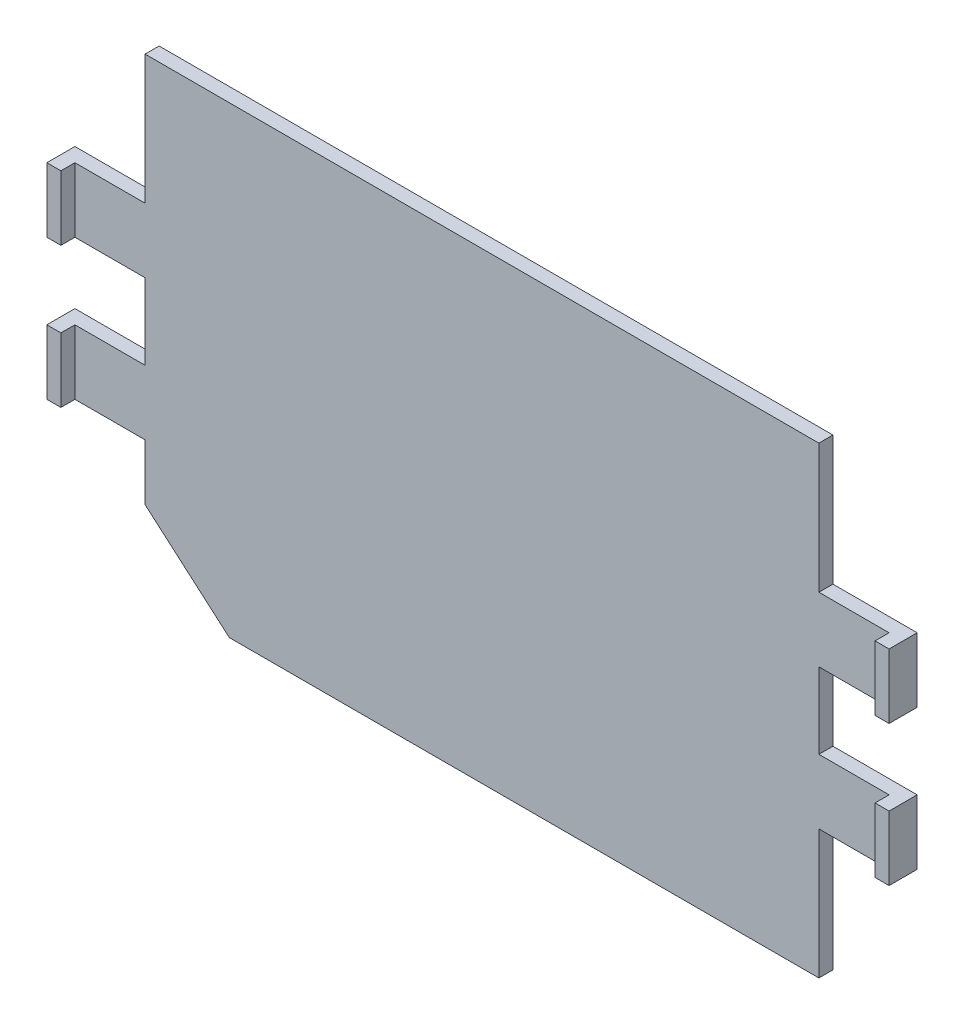
ISO-10303-21;
HEADER;
FILE_DESCRIPTION(('STEP AP214'),'2;1');
FILE_NAME('part.step','',(''),(''),'','','');
FILE_SCHEMA(('AUTOMOTIVE_DESIGN { 1 0 10303 214 1 1 1 1 }'));
ENDSEC;
DATA;
#1=APPLICATION_CONTEXT('core data for automotive mechanical design processes');
#2=APPLICATION_PROTOCOL_DEFINITION('international standard','automotive_design',2000,#1);
#3=PRODUCT_CONTEXT('',#1,'mechanical');
#4=PRODUCT('Part','Part','',(#3));
#5=PRODUCT_RELATED_PRODUCT_CATEGORY('part','',(#4));
#6=PRODUCT_DEFINITION_FORMATION('','',#4);
#7=PRODUCT_DEFINITION_CONTEXT('part definition',#1,'design');
#8=PRODUCT_DEFINITION('design','',#6,#7);
#9=PRODUCT_DEFINITION_SHAPE('','',#8);
#10=(LENGTH_UNIT() NAMED_UNIT(*) SI_UNIT(.MILLI.,.METRE.));
#11=(NAMED_UNIT(*) PLANE_ANGLE_UNIT() SI_UNIT($,.RADIAN.));
#12=(NAMED_UNIT(*) SI_UNIT($,.STERADIAN.) SOLID_ANGLE_UNIT());
#13=UNCERTAINTY_MEASURE_WITH_UNIT(LENGTH_MEASURE(1.E-05),#10,'distance_accuracy_value','');
#14=(GEOMETRIC_REPRESENTATION_CONTEXT(3) GLOBAL_UNCERTAINTY_ASSIGNED_CONTEXT((#13)) GLOBAL_UNIT_ASSIGNED_CONTEXT((#10,
#11,#12)) REPRESENTATION_CONTEXT('',''));
#15=CARTESIAN_POINT('',(0.,0.,0.));
#16=DIRECTION('',(0.,0.,1.));
#17=DIRECTION('',(1.,0.,0.));
#18=AXIS2_PLACEMENT_3D('',#15,#16,#17);
#19=CARTESIAN_POINT('',(-1.45,0.365,0.05));
#20=DIRECTION('',(-1.,0.,0.));
#21=DIRECTION('',(0.,-1.,0.));
#22=AXIS2_PLACEMENT_3D('',#19,#20,#21);
#23=PLANE('',#22);
#24=DIRECTION('',(0.,0.,1.));
#25=VECTOR('',#24,1.);
#26=CARTESIAN_POINT('',(-1.45,0.365,-0.05));
#27=LINE('',#26,#25);
#28=CARTESIAN_POINT('',(-1.45,0.365,0.));
#29=VERTEX_POINT('',#28);
#30=CARTESIAN_POINT('',(-1.45,0.365,0.05));
#31=VERTEX_POINT('',#30);
#32=EDGE_CURVE('E249',#29,#31,#27,.T.);
#33=ORIENTED_EDGE('',*,*,#32,.T.);
#34=DIRECTION('',(0.,1.,0.));
#35=VECTOR('',#34,1.);
#36=CARTESIAN_POINT('',(-1.45,0.,0.05));
#37=LINE('',#36,#35);
#38=CARTESIAN_POINT('',(-1.45,0.135,0.05));
#39=VERTEX_POINT('',#38);
#40=EDGE_CURVE('E20',#31,#39,#37,.F.);
#41=ORIENTED_EDGE('',*,*,#40,.T.);
#42=DIRECTION('',(0.,0.,1.));
#43=VECTOR('',#42,1.);
#44=CARTESIAN_POINT('',(-1.45,0.135,-0.05));
#45=LINE('',#44,#43);
#46=CARTESIAN_POINT('',(-1.45,0.135,0.));
#47=VERTEX_POINT('',#46);
#48=EDGE_CURVE('E246',#39,#47,#45,.F.);
#49=ORIENTED_EDGE('',*,*,#48,.T.);
#50=DIRECTION('',(0.,1.,0.));
#51=VECTOR('',#50,1.);
#52=CARTESIAN_POINT('',(-1.45,0.,0.));
#53=LINE('',#52,#51);
#54=EDGE_CURVE('E282',#47,#29,#53,.T.);
#55=ORIENTED_EDGE('',*,*,#54,.T.);
#56=EDGE_LOOP('',(#33,#41,#49,#55));
#57=FACE_BOUND('',#56,.T.);
#58=ADVANCED_FACE('F17',(#57),#23,.F.);
#59=CARTESIAN_POINT('',(0.,0.,0.05));
#60=DIRECTION('',(0.,0.,-1.));
#61=DIRECTION('',(-1.,0.,0.));
#62=AXIS2_PLACEMENT_3D('',#59,#60,#61);
#63=PLANE('',#62);
#64=DIRECTION('',(1.,0.,0.));
#65=VECTOR('',#64,1.);
#66=CARTESIAN_POINT('',(-1.5,0.135,0.05));
#67=LINE('',#66,#65);
#68=CARTESIAN_POINT('',(-1.5,0.135,0.05));
#69=VERTEX_POINT('',#68);
#70=EDGE_CURVE('E253',#69,#39,#67,.T.);
#71=ORIENTED_EDGE('',*,*,#70,.T.);
#72=ORIENTED_EDGE('',*,*,#40,.F.);
#73=DIRECTION('',(1.,0.,0.));
#74=VECTOR('',#73,1.);
#75=CARTESIAN_POINT('',(-1.2,0.365,0.05));
#76=LINE('',#75,#74);
#77=CARTESIAN_POINT('',(-1.5,0.365,0.05));
#78=VERTEX_POINT('',#77);
#79=EDGE_CURVE('E388',#31,#78,#76,.F.);
#80=ORIENTED_EDGE('',*,*,#79,.T.);
#81=DIRECTION('',(0.,1.,0.));
#82=VECTOR('',#81,1.);
#83=CARTESIAN_POINT('',(-1.5,0.365,0.05));
#84=LINE('',#83,#82);
#85=EDGE_CURVE('E256',#78,#69,#84,.F.);
#86=ORIENTED_EDGE('',*,*,#85,.T.);
#87=EDGE_LOOP('',(#71,#72,#80,#86));
#88=FACE_BOUND('',#87,.T.);
#89=ADVANCED_FACE('F254',(#88),#63,.F.);
#90=CARTESIAN_POINT('',(1.45,0.365,0.05));
#91=DIRECTION('',(1.,0.,0.));
#92=DIRECTION('',(0.,1.,0.));
#93=AXIS2_PLACEMENT_3D('',#90,#91,#92);
#94=PLANE('',#93);
#95=DIRECTION('',(0.,0.,1.));
#96=VECTOR('',#95,1.);
#97=CARTESIAN_POINT('',(1.45,0.135,-0.05));
#98=LINE('',#97,#96);
#99=CARTESIAN_POINT('',(1.45,0.135,0.));
#100=VERTEX_POINT('',#99);
#101=CARTESIAN_POINT('',(1.45,0.135,0.05));
#102=VERTEX_POINT('',#101);
#103=EDGE_CURVE('E353',#100,#102,#98,.T.);
#104=ORIENTED_EDGE('',*,*,#103,.T.);
#105=DIRECTION('',(0.,1.,0.));
#106=VECTOR('',#105,1.);
#107=CARTESIAN_POINT('',(1.45,0.,0.05));
#108=LINE('',#107,#106);
#109=CARTESIAN_POINT('',(1.45,0.365,0.05));
#110=VERTEX_POINT('',#109);
#111=EDGE_CURVE('E238',#102,#110,#108,.T.);
#112=ORIENTED_EDGE('',*,*,#111,.T.);
#113=DIRECTION('',(0.,0.,1.));
#114=VECTOR('',#113,1.);
#115=CARTESIAN_POINT('',(1.45,0.365,-0.05));
#116=LINE('',#115,#114);
#117=CARTESIAN_POINT('',(1.45,0.365,0.));
#118=VERTEX_POINT('',#117);
#119=EDGE_CURVE('E365',#110,#118,#116,.F.);
#120=ORIENTED_EDGE('',*,*,#119,.T.);
#121=DIRECTION('',(0.,1.,0.));
#122=VECTOR('',#121,1.);
#123=CARTESIAN_POINT('',(1.45,0.,0.));
#124=LINE('',#123,#122);
#125=EDGE_CURVE('E280',#118,#100,#124,.F.);
#126=ORIENTED_EDGE('',*,*,#125,.T.);
#127=EDGE_LOOP('',(#104,#112,#120,#126));
#128=FACE_BOUND('',#127,.T.);
#129=ADVANCED_FACE('F534',(#128),#94,.F.);
#130=CARTESIAN_POINT('',(0.,0.,0.05));
#131=DIRECTION('',(0.,0.,-1.));
#132=DIRECTION('',(-1.,0.,0.));
#133=AXIS2_PLACEMENT_3D('',#130,#131,#132);
#134=PLANE('',#133);
#135=DIRECTION('',(1.,0.,0.));
#136=VECTOR('',#135,1.);
#137=CARTESIAN_POINT('',(1.5,0.365,0.05));
#138=LINE('',#137,#136);
#139=CARTESIAN_POINT('',(1.5,0.365,0.05));
#140=VERTEX_POINT('',#139);
#141=EDGE_CURVE('E367',#140,#110,#138,.F.);
#142=ORIENTED_EDGE('',*,*,#141,.T.);
#143=ORIENTED_EDGE('',*,*,#111,.F.);
#144=DIRECTION('',(1.,0.,0.));
#145=VECTOR('',#144,1.);
#146=CARTESIAN_POINT('',(1.2,0.135,0.05));
#147=LINE('',#146,#145);
#148=CARTESIAN_POINT('',(1.5,0.135,0.05));
#149=VERTEX_POINT('',#148);
#150=EDGE_CURVE('E351',#102,#149,#147,.T.);
#151=ORIENTED_EDGE('',*,*,#150,.T.);
#152=DIRECTION('',(0.,-1.,0.));
#153=VECTOR('',#152,1.);
#154=CARTESIAN_POINT('',(1.5,0.135,0.05));
#155=LINE('',#154,#153);
#156=EDGE_CURVE('E360',#149,#140,#155,.F.);
#157=ORIENTED_EDGE('',*,*,#156,.T.);
#158=EDGE_LOOP('',(#142,#143,#151,#157));
#159=FACE_BOUND('',#158,.T.);
#160=ADVANCED_FACE('F536',(#159),#134,.F.);
#161=CARTESIAN_POINT('',(1.45,-0.135,0.05));
#162=DIRECTION('',(1.,0.,0.));
#163=DIRECTION('',(0.,1.,0.));
#164=AXIS2_PLACEMENT_3D('',#161,#162,#163);
#165=PLANE('',#164);
#166=DIRECTION('',(0.,0.,1.));
#167=VECTOR('',#166,1.);
#168=CARTESIAN_POINT('',(1.45,-0.365,-0.05));
#169=LINE('',#168,#167);
#170=CARTESIAN_POINT('',(1.45,-0.365,0.));
#171=VERTEX_POINT('',#170);
#172=CARTESIAN_POINT('',(1.45,-0.365,0.05));
#173=VERTEX_POINT('',#172);
#174=EDGE_CURVE('E326',#171,#173,#169,.T.);
#175=ORIENTED_EDGE('',*,*,#174,.T.);
#176=DIRECTION('',(0.,1.,0.));
#177=VECTOR('',#176,1.);
#178=CARTESIAN_POINT('',(1.45,0.,0.05));
#179=LINE('',#178,#177);
#180=CARTESIAN_POINT('',(1.45,-0.135,0.05));
#181=VERTEX_POINT('',#180);
#182=EDGE_CURVE('E220',#173,#181,#179,.T.);
#183=ORIENTED_EDGE('',*,*,#182,.T.);
#184=DIRECTION('',(0.,0.,1.));
#185=VECTOR('',#184,1.);
#186=CARTESIAN_POINT('',(1.45,-0.135,-0.05));
#187=LINE('',#186,#185);
#188=CARTESIAN_POINT('',(1.45,-0.135,0.));
#189=VERTEX_POINT('',#188);
#190=EDGE_CURVE('E337',#181,#189,#187,.F.);
#191=ORIENTED_EDGE('',*,*,#190,.T.);
#192=DIRECTION('',(0.,1.,0.));
#193=VECTOR('',#192,1.);
#194=CARTESIAN_POINT('',(1.45,0.,0.));
#195=LINE('',#194,#193);
#196=EDGE_CURVE('E278',#189,#171,#195,.F.);
#197=ORIENTED_EDGE('',*,*,#196,.T.);
#198=EDGE_LOOP('',(#175,#183,#191,#197));
#199=FACE_BOUND('',#198,.T.);
#200=ADVANCED_FACE('F530',(#199),#165,.F.);
#201=CARTESIAN_POINT('',(0.,0.,0.05));
#202=DIRECTION('',(0.,0.,-1.));
#203=DIRECTION('',(-1.,0.,0.));
#204=AXIS2_PLACEMENT_3D('',#201,#202,#203);
#205=PLANE('',#204);
#206=DIRECTION('',(1.,0.,0.));
#207=VECTOR('',#206,1.);
#208=CARTESIAN_POINT('',(1.5,-0.135,0.05));
#209=LINE('',#208,#207);
#210=CARTESIAN_POINT('',(1.5,-0.135,0.05));
#211=VERTEX_POINT('',#210);
#212=EDGE_CURVE('E339',#211,#181,#209,.F.);
#213=ORIENTED_EDGE('',*,*,#212,.T.);
#214=ORIENTED_EDGE('',*,*,#182,.F.);
#215=DIRECTION('',(1.,0.,0.));
#216=VECTOR('',#215,1.);
#217=CARTESIAN_POINT('',(1.2,-0.365,0.05));
#218=LINE('',#217,#216);
#219=CARTESIAN_POINT('',(1.5,-0.365,0.05));
#220=VERTEX_POINT('',#219);
#221=EDGE_CURVE('E324',#173,#220,#218,.T.);
#222=ORIENTED_EDGE('',*,*,#221,.T.);
#223=DIRECTION('',(0.,-1.,0.));
#224=VECTOR('',#223,1.);
#225=CARTESIAN_POINT('',(1.5,-0.365,0.05));
#226=LINE('',#225,#224);
#227=EDGE_CURVE('E333',#220,#211,#226,.F.);
#228=ORIENTED_EDGE('',*,*,#227,.T.);
#229=EDGE_LOOP('',(#213,#214,#222,#228));
#230=FACE_BOUND('',#229,.T.);
#231=ADVANCED_FACE('F532',(#230),#205,.F.);
#232=CARTESIAN_POINT('',(0.,0.,0.));
#233=DIRECTION('',(0.,0.,-1.));
#234=DIRECTION('',(-1.,0.,0.));
#235=AXIS2_PLACEMENT_3D('',#232,#233,#234);
#236=PLANE('',#235);
#237=DIRECTION('',(1.,0.,0.));
#238=VECTOR('',#237,1.);
#239=CARTESIAN_POINT('',(1.5,-0.135,0.));
#240=LINE('',#239,#238);
#241=CARTESIAN_POINT('',(1.2,-0.135,0.));
#242=VERTEX_POINT('',#241);
#243=EDGE_CURVE('E335',#189,#242,#240,.F.);
#244=ORIENTED_EDGE('',*,*,#243,.T.);
#245=DIRECTION('',(0.,-1.,0.));
#246=VECTOR('',#245,1.);
#247=CARTESIAN_POINT('',(1.2,-0.135,0.));
#248=LINE('',#247,#246);
#249=CARTESIAN_POINT('',(1.2,0.135,0.));
#250=VERTEX_POINT('',#249);
#251=EDGE_CURVE('E344',#242,#250,#248,.F.);
#252=ORIENTED_EDGE('',*,*,#251,.T.);
#253=DIRECTION('',(1.,0.,0.));
#254=VECTOR('',#253,1.);
#255=CARTESIAN_POINT('',(1.2,0.135,0.));
#256=LINE('',#255,#254);
#257=EDGE_CURVE('E355',#250,#100,#256,.T.);
#258=ORIENTED_EDGE('',*,*,#257,.T.);
#259=ORIENTED_EDGE('',*,*,#125,.F.);
#260=DIRECTION('',(1.,0.,0.));
#261=VECTOR('',#260,1.);
#262=CARTESIAN_POINT('',(1.5,0.365,0.));
#263=LINE('',#262,#261);
#264=CARTESIAN_POINT('',(1.2,0.365,0.));
#265=VERTEX_POINT('',#264);
#266=EDGE_CURVE('E362',#118,#265,#263,.F.);
#267=ORIENTED_EDGE('',*,*,#266,.T.);
#268=DIRECTION('',(0.,-1.,0.));
#269=VECTOR('',#268,1.);
#270=CARTESIAN_POINT('',(1.2,0.365,0.));
#271=LINE('',#270,#269);
#272=CARTESIAN_POINT('',(1.2,0.825,0.));
#273=VERTEX_POINT('',#272);
#274=EDGE_CURVE('E371',#265,#273,#271,.F.);
#275=ORIENTED_EDGE('',*,*,#274,.T.);
#276=DIRECTION('',(1.,0.,0.));
#277=VECTOR('',#276,1.);
#278=CARTESIAN_POINT('',(1.2,0.825,0.));
#279=LINE('',#278,#277);
#280=CARTESIAN_POINT('',(-1.2,0.825,0.));
#281=VERTEX_POINT('',#280);
#282=EDGE_CURVE('E376',#273,#281,#279,.F.);
#283=ORIENTED_EDGE('',*,*,#282,.T.);
#284=DIRECTION('',(0.,1.,0.));
#285=VECTOR('',#284,1.);
#286=CARTESIAN_POINT('',(-1.2,0.825,0.));
#287=LINE('',#286,#285);
#288=CARTESIAN_POINT('',(-1.2,0.365,0.));
#289=VERTEX_POINT('',#288);
#290=EDGE_CURVE('E381',#281,#289,#287,.F.);
#291=ORIENTED_EDGE('',*,*,#290,.T.);
#292=DIRECTION('',(1.,0.,0.));
#293=VECTOR('',#292,1.);
#294=CARTESIAN_POINT('',(-1.2,0.365,0.));
#295=LINE('',#294,#293);
#296=EDGE_CURVE('E391',#289,#29,#295,.F.);
#297=ORIENTED_EDGE('',*,*,#296,.T.);
#298=ORIENTED_EDGE('',*,*,#54,.F.);
#299=DIRECTION('',(1.,0.,0.));
#300=VECTOR('',#299,1.);
#301=CARTESIAN_POINT('',(-1.5,0.135,0.));
#302=LINE('',#301,#300);
#303=CARTESIAN_POINT('',(-1.2,0.135,0.));
#304=VERTEX_POINT('',#303);
#305=EDGE_CURVE('E265',#47,#304,#302,.T.);
#306=ORIENTED_EDGE('',*,*,#305,.T.);
#307=DIRECTION('',(0.,1.,0.));
#308=VECTOR('',#307,1.);
#309=CARTESIAN_POINT('',(-1.2,0.135,0.));
#310=LINE('',#309,#308);
#311=CARTESIAN_POINT('',(-1.2,-0.135,0.));
#312=VERTEX_POINT('',#311);
#313=EDGE_CURVE('E271',#304,#312,#310,.F.);
#314=ORIENTED_EDGE('',*,*,#313,.T.);
#315=DIRECTION('',(-1.,0.,0.));
#316=VECTOR('',#315,1.);
#317=CARTESIAN_POINT('',(0.,-0.135,0.));
#318=LINE('',#317,#316);
#319=CARTESIAN_POINT('',(-1.45,-0.135,0.));
#320=VERTEX_POINT('',#319);
#321=EDGE_CURVE('E234',#320,#312,#318,.F.);
#322=ORIENTED_EDGE('',*,*,#321,.F.);
#323=DIRECTION('',(0.,-1.,0.));
#324=VECTOR('',#323,1.);
#325=CARTESIAN_POINT('',(-1.45,-0.135,0.));
#326=LINE('',#325,#324);
#327=CARTESIAN_POINT('',(-1.45,-0.365,0.));
#328=VERTEX_POINT('',#327);
#329=EDGE_CURVE('E276',#320,#328,#326,.T.);
#330=ORIENTED_EDGE('',*,*,#329,.T.);
#331=DIRECTION('',(-1.,0.,0.));
#332=VECTOR('',#331,1.);
#333=CARTESIAN_POINT('',(0.,-0.365,0.));
#334=LINE('',#333,#332);
#335=CARTESIAN_POINT('',(-1.2,-0.365,0.));
#336=VERTEX_POINT('',#335);
#337=EDGE_CURVE('E232',#336,#328,#334,.T.);
#338=ORIENTED_EDGE('',*,*,#337,.F.);
#339=DIRECTION('',(0.,1.,0.));
#340=VECTOR('',#339,1.);
#341=CARTESIAN_POINT('',(-1.2,0.,0.));
#342=LINE('',#341,#340);
#343=CARTESIAN_POINT('',(-1.2,-0.565,0.));
#344=VERTEX_POINT('',#343);
#345=EDGE_CURVE('E206',#344,#336,#342,.T.);
#346=ORIENTED_EDGE('',*,*,#345,.F.);
#347=DIRECTION('',(-0.755689082789817,0.654930538417842,0.));
#348=VECTOR('',#347,1.);
#349=CARTESIAN_POINT('',(-0.9,-0.825,0.));
#350=LINE('',#349,#348);
#351=CARTESIAN_POINT('',(-0.9,-0.825,0.));
#352=VERTEX_POINT('',#351);
#353=EDGE_CURVE('E211',#352,#344,#350,.T.);
#354=ORIENTED_EDGE('',*,*,#353,.F.);
#355=DIRECTION('',(1.,0.,0.));
#356=VECTOR('',#355,1.);
#357=CARTESIAN_POINT('',(-0.9,-0.825,0.));
#358=LINE('',#357,#356);
#359=CARTESIAN_POINT('',(1.2,-0.825,0.));
#360=VERTEX_POINT('',#359);
#361=EDGE_CURVE('E313',#352,#360,#358,.T.);
#362=ORIENTED_EDGE('',*,*,#361,.T.);
#363=DIRECTION('',(0.,-1.,0.));
#364=VECTOR('',#363,1.);
#365=CARTESIAN_POINT('',(1.2,-0.825,0.));
#366=LINE('',#365,#364);
#367=CARTESIAN_POINT('',(1.2,-0.365,0.));
#368=VERTEX_POINT('',#367);
#369=EDGE_CURVE('E317',#360,#368,#366,.F.);
#370=ORIENTED_EDGE('',*,*,#369,.T.);
#371=DIRECTION('',(1.,0.,0.));
#372=VECTOR('',#371,1.);
#373=CARTESIAN_POINT('',(1.2,-0.365,0.));
#374=LINE('',#373,#372);
#375=EDGE_CURVE('E328',#368,#171,#374,.T.);
#376=ORIENTED_EDGE('',*,*,#375,.T.);
#377=ORIENTED_EDGE('',*,*,#196,.F.);
#378=EDGE_LOOP('',(#244,#252,#258,#259,#267,#275,#283,#291,#297,#298,#306,#314,#322,#330,#338,
#346,#354,#362,#370,#376,#377));
#379=FACE_BOUND('',#378,.T.);
#380=ADVANCED_FACE('F230',(#379),#236,.F.);
#381=CARTESIAN_POINT('',(-1.45,-0.135,0.05));
#382=DIRECTION('',(-1.,0.,0.));
#383=DIRECTION('',(0.,-1.,0.));
#384=AXIS2_PLACEMENT_3D('',#381,#382,#383);
#385=PLANE('',#384);
#386=DIRECTION('',(0.,0.,1.));
#387=VECTOR('',#386,1.);
#388=CARTESIAN_POINT('',(-1.45,-0.135,-0.05));
#389=LINE('',#388,#387);
#390=CARTESIAN_POINT('',(-1.45,-0.135,0.05));
#391=VERTEX_POINT('',#390);
#392=EDGE_CURVE('E290',#320,#391,#389,.T.);
#393=ORIENTED_EDGE('',*,*,#392,.T.);
#394=DIRECTION('',(0.,1.,0.));
#395=VECTOR('',#394,1.);
#396=CARTESIAN_POINT('',(-1.45,0.,0.05));
#397=LINE('',#396,#395);
#398=CARTESIAN_POINT('',(-1.45,-0.365,0.05));
#399=VERTEX_POINT('',#398);
#400=EDGE_CURVE('E274',#391,#399,#397,.F.);
#401=ORIENTED_EDGE('',*,*,#400,.T.);
#402=DIRECTION('',(0.,0.,1.));
#403=VECTOR('',#402,1.);
#404=CARTESIAN_POINT('',(-1.45,-0.365,-0.05));
#405=LINE('',#404,#403);
#406=EDGE_CURVE('E305',#399,#328,#405,.F.);
#407=ORIENTED_EDGE('',*,*,#406,.T.);
#408=ORIENTED_EDGE('',*,*,#329,.F.);
#409=EDGE_LOOP('',(#393,#401,#407,#408));
#410=FACE_BOUND('',#409,.T.);
#411=ADVANCED_FACE('F597',(#410),#385,.F.);
#412=CARTESIAN_POINT('',(0.,0.,0.05));
#413=DIRECTION('',(0.,0.,-1.));
#414=DIRECTION('',(-1.,0.,0.));
#415=AXIS2_PLACEMENT_3D('',#412,#413,#414);
#416=PLANE('',#415);
#417=DIRECTION('',(1.,0.,0.));
#418=VECTOR('',#417,1.);
#419=CARTESIAN_POINT('',(-1.5,-0.365,0.05));
#420=LINE('',#419,#418);
#421=CARTESIAN_POINT('',(-1.5,-0.365,0.05));
#422=VERTEX_POINT('',#421);
#423=EDGE_CURVE('E308',#422,#399,#420,.T.);
#424=ORIENTED_EDGE('',*,*,#423,.T.);
#425=ORIENTED_EDGE('',*,*,#400,.F.);
#426=DIRECTION('',(1.,0.,0.));
#427=VECTOR('',#426,1.);
#428=CARTESIAN_POINT('',(-1.2,-0.135,0.05));
#429=LINE('',#428,#427);
#430=CARTESIAN_POINT('',(-1.5,-0.135,0.05));
#431=VERTEX_POINT('',#430);
#432=EDGE_CURVE('E298',#391,#431,#429,.F.);
#433=ORIENTED_EDGE('',*,*,#432,.T.);
#434=DIRECTION('',(0.,1.,0.));
#435=VECTOR('',#434,1.);
#436=CARTESIAN_POINT('',(-1.5,-0.135,0.05));
#437=LINE('',#436,#435);
#438=EDGE_CURVE('E300',#431,#422,#437,.F.);
#439=ORIENTED_EDGE('',*,*,#438,.T.);
#440=EDGE_LOOP('',(#424,#425,#433,#439));
#441=FACE_BOUND('',#440,.T.);
#442=ADVANCED_FACE('F417',(#441),#416,.F.);
#443=CARTESIAN_POINT('',(-1.2,0.135,-0.05));
#444=DIRECTION('',(1.,0.,0.));
#445=DIRECTION('',(0.,1.,0.));
#446=AXIS2_PLACEMENT_3D('',#443,#444,#445);
#447=PLANE('',#446);
#448=DIRECTION('',(0.,0.,1.));
#449=VECTOR('',#448,1.);
#450=CARTESIAN_POINT('',(-1.2,0.135,-0.05));
#451=LINE('',#450,#449);
#452=CARTESIAN_POINT('',(-1.2,0.135,-0.05));
#453=VERTEX_POINT('',#452);
#454=EDGE_CURVE('E259',#304,#453,#451,.F.);
#455=ORIENTED_EDGE('',*,*,#454,.T.);
#456=DIRECTION('',(0.,1.,0.));
#457=VECTOR('',#456,1.);
#458=CARTESIAN_POINT('',(-1.2,0.,-0.05));
#459=LINE('',#458,#457);
#460=CARTESIAN_POINT('',(-1.2,-0.135,-0.05));
#461=VERTEX_POINT('',#460);
#462=EDGE_CURVE('E295',#461,#453,#459,.T.);
#463=ORIENTED_EDGE('',*,*,#462,.F.);
#464=DIRECTION('',(0.,0.,1.));
#465=VECTOR('',#464,1.);
#466=CARTESIAN_POINT('',(-1.2,-0.135,-0.05));
#467=LINE('',#466,#465);
#468=EDGE_CURVE('E289',#461,#312,#467,.T.);
#469=ORIENTED_EDGE('',*,*,#468,.T.);
#470=ORIENTED_EDGE('',*,*,#313,.F.);
#471=EDGE_LOOP('',(#455,#463,#469,#470));
#472=FACE_BOUND('',#471,.T.);
#473=ADVANCED_FACE('F293',(#472),#447,.F.);
#474=CARTESIAN_POINT('',(-1.5,0.135,-0.05));
#475=DIRECTION('',(0.,1.,0.));
#476=DIRECTION('',(0.,0.,1.));
#477=AXIS2_PLACEMENT_3D('',#474,#475,#476);
#478=PLANE('',#477);
#479=ORIENTED_EDGE('',*,*,#48,.F.);
#480=ORIENTED_EDGE('',*,*,#70,.F.);
#481=DIRECTION('',(0.,0.,1.));
#482=VECTOR('',#481,1.);
#483=CARTESIAN_POINT('',(-1.5,0.135,-0.05));
#484=LINE('',#483,#482);
#485=CARTESIAN_POINT('',(-1.5,0.135,-0.05));
#486=VERTEX_POINT('',#485);
#487=EDGE_CURVE('E394',#69,#486,#484,.F.);
#488=ORIENTED_EDGE('',*,*,#487,.T.);
#489=DIRECTION('',(-1.,0.,0.));
#490=VECTOR('',#489,1.);
#491=CARTESIAN_POINT('',(0.,0.135,-0.05));
#492=LINE('',#491,#490);
#493=EDGE_CURVE('E398',#453,#486,#492,.T.);
#494=ORIENTED_EDGE('',*,*,#493,.F.);
#495=ORIENTED_EDGE('',*,*,#454,.F.);
#496=ORIENTED_EDGE('',*,*,#305,.F.);
#497=EDGE_LOOP('',(#479,#480,#488,#494,#495,#496));
#498=FACE_BOUND('',#497,.T.);
#499=ADVANCED_FACE('F262',(#498),#478,.F.);
#500=CARTESIAN_POINT('',(-1.5,0.365,-0.05));
#501=DIRECTION('',(1.,0.,0.));
#502=DIRECTION('',(0.,1.,0.));
#503=AXIS2_PLACEMENT_3D('',#500,#501,#502);
#504=PLANE('',#503);
#505=ORIENTED_EDGE('',*,*,#85,.F.);
#506=DIRECTION('',(0.,0.,1.));
#507=VECTOR('',#506,1.);
#508=CARTESIAN_POINT('',(-1.5,0.365,-0.05));
#509=LINE('',#508,#507);
#510=CARTESIAN_POINT('',(-1.5,0.365,-0.05));
#511=VERTEX_POINT('',#510);
#512=EDGE_CURVE('E386',#78,#511,#509,.F.);
#513=ORIENTED_EDGE('',*,*,#512,.T.);
#514=DIRECTION('',(0.,1.,0.));
#515=VECTOR('',#514,1.);
#516=CARTESIAN_POINT('',(-1.5,0.,-0.05));
#517=LINE('',#516,#515);
#518=EDGE_CURVE('E401',#486,#511,#517,.T.);
#519=ORIENTED_EDGE('',*,*,#518,.F.);
#520=ORIENTED_EDGE('',*,*,#487,.F.);
#521=EDGE_LOOP('',(#505,#513,#519,#520));
#522=FACE_BOUND('',#521,.T.);
#523=ADVANCED_FACE('F402',(#522),#504,.F.);
#524=CARTESIAN_POINT('',(-1.2,0.365,-0.05));
#525=DIRECTION('',(0.,-1.,0.));
#526=DIRECTION('',(1.,0.,0.));
#527=AXIS2_PLACEMENT_3D('',#524,#525,#526);
#528=PLANE('',#527);
#529=ORIENTED_EDGE('',*,*,#79,.F.);
#530=ORIENTED_EDGE('',*,*,#32,.F.);
#531=ORIENTED_EDGE('',*,*,#296,.F.);
#532=DIRECTION('',(0.,0.,1.));
#533=VECTOR('',#532,1.);
#534=CARTESIAN_POINT('',(-1.2,0.365,-0.05));
#535=LINE('',#534,#533);
#536=CARTESIAN_POINT('',(-1.2,0.365,-0.05));
#537=VERTEX_POINT('',#536);
#538=EDGE_CURVE('E384',#289,#537,#535,.F.);
#539=ORIENTED_EDGE('',*,*,#538,.T.);
#540=DIRECTION('',(-1.,0.,0.));
#541=VECTOR('',#540,1.);
#542=CARTESIAN_POINT('',(0.,0.365,-0.05));
#543=LINE('',#542,#541);
#544=EDGE_CURVE('E407',#511,#537,#543,.F.);
#545=ORIENTED_EDGE('',*,*,#544,.F.);
#546=ORIENTED_EDGE('',*,*,#512,.F.);
#547=EDGE_LOOP('',(#529,#530,#531,#539,#545,#546));
#548=FACE_BOUND('',#547,.T.);
#549=ADVANCED_FACE('F467',(#548),#528,.F.);
#550=CARTESIAN_POINT('',(-1.2,0.825,-0.05));
#551=DIRECTION('',(1.,0.,0.));
#552=DIRECTION('',(0.,1.,0.));
#553=AXIS2_PLACEMENT_3D('',#550,#551,#552);
#554=PLANE('',#553);
#555=DIRECTION('',(0.,0.,-1.));
#556=VECTOR('',#555,1.);
#557=CARTESIAN_POINT('',(-1.2,0.825,-0.05));
#558=LINE('',#557,#556);
#559=CARTESIAN_POINT('',(-1.2,0.825,-0.05));
#560=VERTEX_POINT('',#559);
#561=EDGE_CURVE('E379',#281,#560,#558,.T.);
#562=ORIENTED_EDGE('',*,*,#561,.T.);
#563=DIRECTION('',(0.,1.,0.));
#564=VECTOR('',#563,1.);
#565=CARTESIAN_POINT('',(-1.2,0.,-0.05));
#566=LINE('',#565,#564);
#567=EDGE_CURVE('E463',#537,#560,#566,.T.);
#568=ORIENTED_EDGE('',*,*,#567,.F.);
#569=ORIENTED_EDGE('',*,*,#538,.F.);
#570=ORIENTED_EDGE('',*,*,#290,.F.);
#571=EDGE_LOOP('',(#562,#568,#569,#570));
#572=FACE_BOUND('',#571,.T.);
#573=ADVANCED_FACE('F470',(#572),#554,.F.);
#574=CARTESIAN_POINT('',(1.2,0.825,-0.05));
#575=DIRECTION('',(0.,-1.,0.));
#576=DIRECTION('',(0.,0.,-1.));
#577=AXIS2_PLACEMENT_3D('',#574,#575,#576);
#578=PLANE('',#577);
#579=DIRECTION('',(0.,0.,1.));
#580=VECTOR('',#579,1.);
#581=CARTESIAN_POINT('',(1.2,0.825,-0.05));
#582=LINE('',#581,#580);
#583=CARTESIAN_POINT('',(1.2,0.825,-0.05));
#584=VERTEX_POINT('',#583);
#585=EDGE_CURVE('E374',#273,#584,#582,.F.);
#586=ORIENTED_EDGE('',*,*,#585,.T.);
#587=DIRECTION('',(-1.,0.,0.));
#588=VECTOR('',#587,1.);
#589=CARTESIAN_POINT('',(0.,0.825,-0.05));
#590=LINE('',#589,#588);
#591=EDGE_CURVE('E460',#560,#584,#590,.F.);
#592=ORIENTED_EDGE('',*,*,#591,.F.);
#593=ORIENTED_EDGE('',*,*,#561,.F.);
#594=ORIENTED_EDGE('',*,*,#282,.F.);
#595=EDGE_LOOP('',(#586,#592,#593,#594));
#596=FACE_BOUND('',#595,.T.);
#597=ADVANCED_FACE('F474',(#596),#578,.F.);
#598=CARTESIAN_POINT('',(1.2,0.365,-0.05));
#599=DIRECTION('',(-1.,0.,0.));
#600=DIRECTION('',(0.,-1.,0.));
#601=AXIS2_PLACEMENT_3D('',#598,#599,#600);
#602=PLANE('',#601);
#603=DIRECTION('',(0.,0.,1.));
#604=VECTOR('',#603,1.);
#605=CARTESIAN_POINT('',(1.2,0.365,-0.05));
#606=LINE('',#605,#604);
#607=CARTESIAN_POINT('',(1.2,0.365,-0.05));
#608=VERTEX_POINT('',#607);
#609=EDGE_CURVE('E369',#265,#608,#606,.F.);
#610=ORIENTED_EDGE('',*,*,#609,.T.);
#611=DIRECTION('',(0.,1.,0.));
#612=VECTOR('',#611,1.);
#613=CARTESIAN_POINT('',(1.2,0.,-0.05));
#614=LINE('',#613,#612);
#615=EDGE_CURVE('E457',#584,#608,#614,.F.);
#616=ORIENTED_EDGE('',*,*,#615,.F.);
#617=ORIENTED_EDGE('',*,*,#585,.F.);
#618=ORIENTED_EDGE('',*,*,#274,.F.);
#619=EDGE_LOOP('',(#610,#616,#617,#618));
#620=FACE_BOUND('',#619,.T.);
#621=ADVANCED_FACE('F479',(#620),#602,.F.);
#622=CARTESIAN_POINT('',(1.5,0.365,-0.05));
#623=DIRECTION('',(0.,-1.,0.));
#624=DIRECTION('',(1.,0.,0.));
#625=AXIS2_PLACEMENT_3D('',#622,#623,#624);
#626=PLANE('',#625);
#627=ORIENTED_EDGE('',*,*,#119,.F.);
#628=ORIENTED_EDGE('',*,*,#141,.F.);
#629=DIRECTION('',(0.,0.,1.));
#630=VECTOR('',#629,1.);
#631=CARTESIAN_POINT('',(1.5,0.365,-0.05));
#632=LINE('',#631,#630);
#633=CARTESIAN_POINT('',(1.5,0.365,-0.05));
#634=VERTEX_POINT('',#633);
#635=EDGE_CURVE('E358',#140,#634,#632,.F.);
#636=ORIENTED_EDGE('',*,*,#635,.T.);
#637=DIRECTION('',(-1.,0.,0.));
#638=VECTOR('',#637,1.);
#639=CARTESIAN_POINT('',(0.,0.365,-0.05));
#640=LINE('',#639,#638);
#641=EDGE_CURVE('E454',#608,#634,#640,.F.);
#642=ORIENTED_EDGE('',*,*,#641,.F.);
#643=ORIENTED_EDGE('',*,*,#609,.F.);
#644=ORIENTED_EDGE('',*,*,#266,.F.);
#645=EDGE_LOOP('',(#627,#628,#636,#642,#643,#644));
#646=FACE_BOUND('',#645,.T.);
#647=ADVANCED_FACE('F484',(#646),#626,.F.);
#648=CARTESIAN_POINT('',(1.5,0.135,-0.05));
#649=DIRECTION('',(-1.,0.,0.));
#650=DIRECTION('',(0.,-1.,0.));
#651=AXIS2_PLACEMENT_3D('',#648,#649,#650);
#652=PLANE('',#651);
#653=ORIENTED_EDGE('',*,*,#156,.F.);
#654=DIRECTION('',(0.,0.,1.));
#655=VECTOR('',#654,1.);
#656=CARTESIAN_POINT('',(1.5,0.135,-0.05));
#657=LINE('',#656,#655);
#658=CARTESIAN_POINT('',(1.5,0.135,-0.05));
#659=VERTEX_POINT('',#658);
#660=EDGE_CURVE('E349',#149,#659,#657,.F.);
#661=ORIENTED_EDGE('',*,*,#660,.T.);
#662=DIRECTION('',(0.,1.,0.));
#663=VECTOR('',#662,1.);
#664=CARTESIAN_POINT('',(1.5,0.,-0.05));
#665=LINE('',#664,#663);
#666=EDGE_CURVE('E451',#634,#659,#665,.F.);
#667=ORIENTED_EDGE('',*,*,#666,.F.);
#668=ORIENTED_EDGE('',*,*,#635,.F.);
#669=EDGE_LOOP('',(#653,#661,#667,#668));
#670=FACE_BOUND('',#669,.T.);
#671=ADVANCED_FACE('F490',(#670),#652,.F.);
#672=CARTESIAN_POINT('',(1.2,0.135,-0.05));
#673=DIRECTION('',(0.,1.,0.));
#674=DIRECTION('',(0.,0.,1.));
#675=AXIS2_PLACEMENT_3D('',#672,#673,#674);
#676=PLANE('',#675);
#677=ORIENTED_EDGE('',*,*,#150,.F.);
#678=ORIENTED_EDGE('',*,*,#103,.F.);
#679=ORIENTED_EDGE('',*,*,#257,.F.);
#680=DIRECTION('',(0.,0.,1.));
#681=VECTOR('',#680,1.);
#682=CARTESIAN_POINT('',(1.2,0.135,-0.05));
#683=LINE('',#682,#681);
#684=CARTESIAN_POINT('',(1.2,0.135,-0.05));
#685=VERTEX_POINT('',#684);
#686=EDGE_CURVE('E347',#250,#685,#683,.F.);
#687=ORIENTED_EDGE('',*,*,#686,.T.);
#688=DIRECTION('',(-1.,0.,0.));
#689=VECTOR('',#688,1.);
#690=CARTESIAN_POINT('',(0.,0.135,-0.05));
#691=LINE('',#690,#689);
#692=EDGE_CURVE('E448',#659,#685,#691,.T.);
#693=ORIENTED_EDGE('',*,*,#692,.F.);
#694=ORIENTED_EDGE('',*,*,#660,.F.);
#695=EDGE_LOOP('',(#677,#678,#679,#687,#693,#694));
#696=FACE_BOUND('',#695,.T.);
#697=ADVANCED_FACE('F496',(#696),#676,.F.);
#698=CARTESIAN_POINT('',(1.2,-0.135,-0.05));
#699=DIRECTION('',(-1.,0.,0.));
#700=DIRECTION('',(0.,-1.,0.));
#701=AXIS2_PLACEMENT_3D('',#698,#699,#700);
#702=PLANE('',#701);
#703=DIRECTION('',(0.,0.,1.));
#704=VECTOR('',#703,1.);
#705=CARTESIAN_POINT('',(1.2,-0.135,-0.05));
#706=LINE('',#705,#704);
#707=CARTESIAN_POINT('',(1.2,-0.135,-0.05));
#708=VERTEX_POINT('',#707);
#709=EDGE_CURVE('E342',#242,#708,#706,.F.);
#710=ORIENTED_EDGE('',*,*,#709,.T.);
#711=DIRECTION('',(0.,1.,0.));
#712=VECTOR('',#711,1.);
#713=CARTESIAN_POINT('',(1.2,0.,-0.05));
#714=LINE('',#713,#712);
#715=EDGE_CURVE('E445',#685,#708,#714,.F.);
#716=ORIENTED_EDGE('',*,*,#715,.F.);
#717=ORIENTED_EDGE('',*,*,#686,.F.);
#718=ORIENTED_EDGE('',*,*,#251,.F.);
#719=EDGE_LOOP('',(#710,#716,#717,#718));
#720=FACE_BOUND('',#719,.T.);
#721=ADVANCED_FACE('F500',(#720),#702,.F.);
#722=CARTESIAN_POINT('',(1.5,-0.135,-0.05));
#723=DIRECTION('',(0.,-1.,0.));
#724=DIRECTION('',(1.,0.,0.));
#725=AXIS2_PLACEMENT_3D('',#722,#723,#724);
#726=PLANE('',#725);
#727=ORIENTED_EDGE('',*,*,#190,.F.);
#728=ORIENTED_EDGE('',*,*,#212,.F.);
#729=DIRECTION('',(0.,0.,1.));
#730=VECTOR('',#729,1.);
#731=CARTESIAN_POINT('',(1.5,-0.135,-0.05));
#732=LINE('',#731,#730);
#733=CARTESIAN_POINT('',(1.5,-0.135,-0.05));
#734=VERTEX_POINT('',#733);
#735=EDGE_CURVE('E331',#211,#734,#732,.F.);
#736=ORIENTED_EDGE('',*,*,#735,.T.);
#737=DIRECTION('',(-1.,0.,0.));
#738=VECTOR('',#737,1.);
#739=CARTESIAN_POINT('',(0.,-0.135,-0.05));
#740=LINE('',#739,#738);
#741=EDGE_CURVE('E442',#708,#734,#740,.F.);
#742=ORIENTED_EDGE('',*,*,#741,.F.);
#743=ORIENTED_EDGE('',*,*,#709,.F.);
#744=ORIENTED_EDGE('',*,*,#243,.F.);
#745=EDGE_LOOP('',(#727,#728,#736,#742,#743,#744));
#746=FACE_BOUND('',#745,.T.);
#747=ADVANCED_FACE('F506',(#746),#726,.F.);
#748=CARTESIAN_POINT('',(1.5,-0.365,-0.05));
#749=DIRECTION('',(-1.,0.,0.));
#750=DIRECTION('',(0.,-1.,0.));
#751=AXIS2_PLACEMENT_3D('',#748,#749,#750);
#752=PLANE('',#751);
#753=ORIENTED_EDGE('',*,*,#227,.F.);
#754=DIRECTION('',(0.,0.,1.));
#755=VECTOR('',#754,1.);
#756=CARTESIAN_POINT('',(1.5,-0.365,-0.05));
#757=LINE('',#756,#755);
#758=CARTESIAN_POINT('',(1.5,-0.365,-0.05));
#759=VERTEX_POINT('',#758);
#760=EDGE_CURVE('E322',#220,#759,#757,.F.);
#761=ORIENTED_EDGE('',*,*,#760,.T.);
#762=DIRECTION('',(0.,1.,0.));
#763=VECTOR('',#762,1.);
#764=CARTESIAN_POINT('',(1.5,0.,-0.05));
#765=LINE('',#764,#763);
#766=EDGE_CURVE('E439',#734,#759,#765,.F.);
#767=ORIENTED_EDGE('',*,*,#766,.F.);
#768=ORIENTED_EDGE('',*,*,#735,.F.);
#769=EDGE_LOOP('',(#753,#761,#767,#768));
#770=FACE_BOUND('',#769,.T.);
#771=ADVANCED_FACE('F513',(#770),#752,.F.);
#772=CARTESIAN_POINT('',(1.2,-0.365,-0.05));
#773=DIRECTION('',(0.,1.,0.));
#774=DIRECTION('',(0.,0.,1.));
#775=AXIS2_PLACEMENT_3D('',#772,#773,#774);
#776=PLANE('',#775);
#777=ORIENTED_EDGE('',*,*,#221,.F.);
#778=ORIENTED_EDGE('',*,*,#174,.F.);
#779=ORIENTED_EDGE('',*,*,#375,.F.);
#780=DIRECTION('',(0.,0.,1.));
#781=VECTOR('',#780,1.);
#782=CARTESIAN_POINT('',(1.2,-0.365,-0.05));
#783=LINE('',#782,#781);
#784=CARTESIAN_POINT('',(1.2,-0.365,-0.05));
#785=VERTEX_POINT('',#784);
#786=EDGE_CURVE('E320',#368,#785,#783,.F.);
#787=ORIENTED_EDGE('',*,*,#786,.T.);
#788=DIRECTION('',(-1.,0.,0.));
#789=VECTOR('',#788,1.);
#790=CARTESIAN_POINT('',(0.,-0.365,-0.05));
#791=LINE('',#790,#789);
#792=EDGE_CURVE('E436',#759,#785,#791,.T.);
#793=ORIENTED_EDGE('',*,*,#792,.F.);
#794=ORIENTED_EDGE('',*,*,#760,.F.);
#795=EDGE_LOOP('',(#777,#778,#779,#787,#793,#794));
#796=FACE_BOUND('',#795,.T.);
#797=ADVANCED_FACE('F517',(#796),#776,.F.);
#798=CARTESIAN_POINT('',(1.2,-0.825,-0.05));
#799=DIRECTION('',(-1.,0.,0.));
#800=DIRECTION('',(0.,-1.,0.));
#801=AXIS2_PLACEMENT_3D('',#798,#799,#800);
#802=PLANE('',#801);
#803=DIRECTION('',(0.,0.,1.));
#804=VECTOR('',#803,1.);
#805=CARTESIAN_POINT('',(1.2,-0.825,-0.05));
#806=LINE('',#805,#804);
#807=CARTESIAN_POINT('',(1.2,-0.825,-0.05));
#808=VERTEX_POINT('',#807);
#809=EDGE_CURVE('E315',#360,#808,#806,.F.);
#810=ORIENTED_EDGE('',*,*,#809,.T.);
#811=DIRECTION('',(0.,1.,0.));
#812=VECTOR('',#811,1.);
#813=CARTESIAN_POINT('',(1.2,0.,-0.05));
#814=LINE('',#813,#812);
#815=EDGE_CURVE('E433',#785,#808,#814,.F.);
#816=ORIENTED_EDGE('',*,*,#815,.F.);
#817=ORIENTED_EDGE('',*,*,#786,.F.);
#818=ORIENTED_EDGE('',*,*,#369,.F.);
#819=EDGE_LOOP('',(#810,#816,#817,#818));
#820=FACE_BOUND('',#819,.T.);
#821=ADVANCED_FACE('F522',(#820),#802,.F.);
#822=CARTESIAN_POINT('',(-0.9,-0.825,-0.05));
#823=DIRECTION('',(0.,1.,0.));
#824=DIRECTION('',(0.,0.,1.));
#825=AXIS2_PLACEMENT_3D('',#822,#823,#824);
#826=PLANE('',#825);
#827=DIRECTION('',(0.,0.,1.));
#828=VECTOR('',#827,1.);
#829=CARTESIAN_POINT('',(-0.9,-0.825,-0.05));
#830=LINE('',#829,#828);
#831=CARTESIAN_POINT('',(-0.9,-0.825,-0.05));
#832=VERTEX_POINT('',#831);
#833=EDGE_CURVE('E216',#352,#832,#830,.F.);
#834=ORIENTED_EDGE('',*,*,#833,.T.);
#835=DIRECTION('',(-1.,0.,0.));
#836=VECTOR('',#835,1.);
#837=CARTESIAN_POINT('',(0.,-0.825,-0.05));
#838=LINE('',#837,#836);
#839=EDGE_CURVE('E430',#808,#832,#838,.T.);
#840=ORIENTED_EDGE('',*,*,#839,.F.);
#841=ORIENTED_EDGE('',*,*,#809,.F.);
#842=ORIENTED_EDGE('',*,*,#361,.F.);
#843=EDGE_LOOP('',(#834,#840,#841,#842));
#844=FACE_BOUND('',#843,.T.);
#845=ADVANCED_FACE('F526',(#844),#826,.F.);
#846=CARTESIAN_POINT('',(-1.2,-0.565,-0.05));
#847=DIRECTION('',(0.654930538417842,0.755689082789818,0.));
#848=DIRECTION('',(-0.755689082789818,0.654930538417842,0.));
#849=AXIS2_PLACEMENT_3D('',#846,#847,#848);
#850=PLANE('',#849);
#851=DIRECTION('',(0.,0.,1.));
#852=VECTOR('',#851,1.);
#853=CARTESIAN_POINT('',(-1.2,-0.565,-0.05));
#854=LINE('',#853,#852);
#855=CARTESIAN_POINT('',(-1.2,-0.565,-0.05));
#856=VERTEX_POINT('',#855);
#857=EDGE_CURVE('E214',#344,#856,#854,.F.);
#858=ORIENTED_EDGE('',*,*,#857,.T.);
#859=DIRECTION('',(-0.755689082789817,0.654930538417842,0.));
#860=VECTOR('',#859,1.);
#861=CARTESIAN_POINT('',(-0.9,-0.825,-0.05));
#862=LINE('',#861,#860);
#863=EDGE_CURVE('E428',#832,#856,#862,.T.);
#864=ORIENTED_EDGE('',*,*,#863,.F.);
#865=ORIENTED_EDGE('',*,*,#833,.F.);
#866=ORIENTED_EDGE('',*,*,#353,.T.);
#867=EDGE_LOOP('',(#858,#864,#865,#866));
#868=FACE_BOUND('',#867,.T.);
#869=ADVANCED_FACE('F212',(#868),#850,.F.);
#870=CARTESIAN_POINT('',(-1.2,-0.365,-0.05));
#871=DIRECTION('',(1.,0.,0.));
#872=DIRECTION('',(0.,1.,0.));
#873=AXIS2_PLACEMENT_3D('',#870,#871,#872);
#874=PLANE('',#873);
#875=DIRECTION('',(0.,0.,1.));
#876=VECTOR('',#875,1.);
#877=CARTESIAN_POINT('',(-1.2,-0.365,-0.05));
#878=LINE('',#877,#876);
#879=CARTESIAN_POINT('',(-1.2,-0.365,-0.05));
#880=VERTEX_POINT('',#879);
#881=EDGE_CURVE('E226',#336,#880,#878,.F.);
#882=ORIENTED_EDGE('',*,*,#881,.T.);
#883=DIRECTION('',(0.,1.,0.));
#884=VECTOR('',#883,1.);
#885=CARTESIAN_POINT('',(-1.2,0.,-0.05));
#886=LINE('',#885,#884);
#887=EDGE_CURVE('E224',#856,#880,#886,.T.);
#888=ORIENTED_EDGE('',*,*,#887,.F.);
#889=ORIENTED_EDGE('',*,*,#857,.F.);
#890=ORIENTED_EDGE('',*,*,#345,.T.);
#891=EDGE_LOOP('',(#882,#888,#889,#890));
#892=FACE_BOUND('',#891,.T.);
#893=ADVANCED_FACE('F222',(#892),#874,.F.);
#894=CARTESIAN_POINT('',(-1.5,-0.365,-0.05));
#895=DIRECTION('',(0.,1.,0.));
#896=DIRECTION('',(0.,0.,1.));
#897=AXIS2_PLACEMENT_3D('',#894,#895,#896);
#898=PLANE('',#897);
#899=ORIENTED_EDGE('',*,*,#406,.F.);
#900=ORIENTED_EDGE('',*,*,#423,.F.);
#901=DIRECTION('',(0.,0.,1.));
#902=VECTOR('',#901,1.);
#903=CARTESIAN_POINT('',(-1.5,-0.365,-0.05));
#904=LINE('',#903,#902);
#905=CARTESIAN_POINT('',(-1.5,-0.365,-0.05));
#906=VERTEX_POINT('',#905);
#907=EDGE_CURVE('E296',#422,#906,#904,.F.);
#908=ORIENTED_EDGE('',*,*,#907,.T.);
#909=DIRECTION('',(-1.,0.,0.));
#910=VECTOR('',#909,1.);
#911=CARTESIAN_POINT('',(0.,-0.365,-0.05));
#912=LINE('',#911,#910);
#913=EDGE_CURVE('E423',#880,#906,#912,.T.);
#914=ORIENTED_EDGE('',*,*,#913,.F.);
#915=ORIENTED_EDGE('',*,*,#881,.F.);
#916=ORIENTED_EDGE('',*,*,#337,.T.);
#917=EDGE_LOOP('',(#899,#900,#908,#914,#915,#916));
#918=FACE_BOUND('',#917,.T.);
#919=ADVANCED_FACE('F555',(#918),#898,.F.);
#920=CARTESIAN_POINT('',(-1.5,-0.135,-0.05));
#921=DIRECTION('',(1.,0.,0.));
#922=DIRECTION('',(0.,1.,0.));
#923=AXIS2_PLACEMENT_3D('',#920,#921,#922);
#924=PLANE('',#923);
#925=ORIENTED_EDGE('',*,*,#438,.F.);
#926=DIRECTION('',(0.,0.,1.));
#927=VECTOR('',#926,1.);
#928=CARTESIAN_POINT('',(-1.5,-0.135,-0.05));
#929=LINE('',#928,#927);
#930=CARTESIAN_POINT('',(-1.5,-0.135,-0.05));
#931=VERTEX_POINT('',#930);
#932=EDGE_CURVE('E35',#431,#931,#929,.F.);
#933=ORIENTED_EDGE('',*,*,#932,.T.);
#934=DIRECTION('',(0.,1.,0.));
#935=VECTOR('',#934,1.);
#936=CARTESIAN_POINT('',(-1.5,0.,-0.05));
#937=LINE('',#936,#935);
#938=EDGE_CURVE('E26',#906,#931,#937,.T.);
#939=ORIENTED_EDGE('',*,*,#938,.F.);
#940=ORIENTED_EDGE('',*,*,#907,.F.);
#941=EDGE_LOOP('',(#925,#933,#939,#940));
#942=FACE_BOUND('',#941,.T.);
#943=ADVANCED_FACE('F420',(#942),#924,.F.);
#944=CARTESIAN_POINT('',(-1.2,-0.135,-0.05));
#945=DIRECTION('',(0.,-1.,0.));
#946=DIRECTION('',(1.,0.,0.));
#947=AXIS2_PLACEMENT_3D('',#944,#945,#946);
#948=PLANE('',#947);
#949=ORIENTED_EDGE('',*,*,#432,.F.);
#950=ORIENTED_EDGE('',*,*,#392,.F.);
#951=ORIENTED_EDGE('',*,*,#321,.T.);
#952=ORIENTED_EDGE('',*,*,#468,.F.);
#953=DIRECTION('',(-1.,0.,0.));
#954=VECTOR('',#953,1.);
#955=CARTESIAN_POINT('',(0.,-0.135,-0.05));
#956=LINE('',#955,#954);
#957=EDGE_CURVE('E11',#931,#461,#956,.F.);
#958=ORIENTED_EDGE('',*,*,#957,.F.);
#959=ORIENTED_EDGE('',*,*,#932,.F.);
#960=EDGE_LOOP('',(#949,#950,#951,#952,#958,#959));
#961=FACE_BOUND('',#960,.T.);
#962=ADVANCED_FACE('F287',(#961),#948,.F.);
#963=CARTESIAN_POINT('',(0.,0.,-0.05));
#964=DIRECTION('',(0.,0.,-1.));
#965=DIRECTION('',(-1.,0.,0.));
#966=AXIS2_PLACEMENT_3D('',#963,#964,#965);
#967=PLANE('',#966);
#968=ORIENTED_EDGE('',*,*,#938,.T.);
#969=ORIENTED_EDGE('',*,*,#957,.T.);
#970=ORIENTED_EDGE('',*,*,#462,.T.);
#971=ORIENTED_EDGE('',*,*,#493,.T.);
#972=ORIENTED_EDGE('',*,*,#518,.T.);
#973=ORIENTED_EDGE('',*,*,#544,.T.);
#974=ORIENTED_EDGE('',*,*,#567,.T.);
#975=ORIENTED_EDGE('',*,*,#591,.T.);
#976=ORIENTED_EDGE('',*,*,#615,.T.);
#977=ORIENTED_EDGE('',*,*,#641,.T.);
#978=ORIENTED_EDGE('',*,*,#666,.T.);
#979=ORIENTED_EDGE('',*,*,#692,.T.);
#980=ORIENTED_EDGE('',*,*,#715,.T.);
#981=ORIENTED_EDGE('',*,*,#741,.T.);
#982=ORIENTED_EDGE('',*,*,#766,.T.);
#983=ORIENTED_EDGE('',*,*,#792,.T.);
#984=ORIENTED_EDGE('',*,*,#815,.T.);
#985=ORIENTED_EDGE('',*,*,#839,.T.);
#986=ORIENTED_EDGE('',*,*,#863,.T.);
#987=ORIENTED_EDGE('',*,*,#887,.T.);
#988=ORIENTED_EDGE('',*,*,#913,.T.);
#989=EDGE_LOOP('',(#968,#969,#970,#971,#972,#973,#974,#975,#976,#977,#978,#979,#980,#981,#982,
#983,#984,#985,#986,#987,#988));
#990=FACE_BOUND('',#989,.T.);
#991=ADVANCED_FACE('F410',(#990),#967,.T.);
#992=CLOSED_SHELL('',(#58,#89,#129,#160,#200,#231,#380,#411,#442,#473,#499,#523,#549,#573,#597,
#621,#647,#671,#697,#721,#747,#771,#797,#821,#845,#869,#893,#919,#943,#962,#991));
#993=MANIFOLD_SOLID_BREP('B1',#992);
#994=ADVANCED_BREP_SHAPE_REPRESENTATION('',(#18,#993),#14);
#995=SHAPE_DEFINITION_REPRESENTATION(#9,#994);
ENDSEC;
END-ISO-10303-21;
